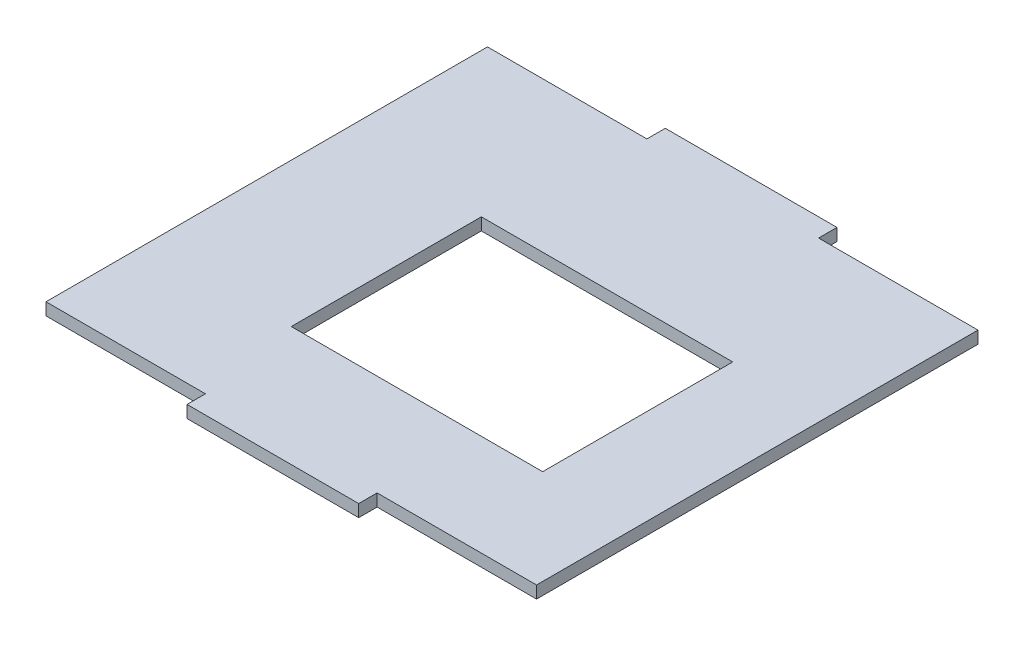
ISO-10303-21;
HEADER;
FILE_DESCRIPTION(('STEP AP214'),'2;1');
FILE_NAME('part.step','',(''),(''),'','','');
FILE_SCHEMA(('AUTOMOTIVE_DESIGN { 1 0 10303 214 1 1 1 1 }'));
ENDSEC;
DATA;
#1=APPLICATION_CONTEXT('core data for automotive mechanical design processes');
#2=APPLICATION_PROTOCOL_DEFINITION('international standard','automotive_design',2000,#1);
#3=PRODUCT_CONTEXT('',#1,'mechanical');
#4=PRODUCT('Part','Part','',(#3));
#5=PRODUCT_RELATED_PRODUCT_CATEGORY('part','',(#4));
#6=PRODUCT_DEFINITION_FORMATION('','',#4);
#7=PRODUCT_DEFINITION_CONTEXT('part definition',#1,'design');
#8=PRODUCT_DEFINITION('design','',#6,#7);
#9=PRODUCT_DEFINITION_SHAPE('','',#8);
#10=(LENGTH_UNIT() NAMED_UNIT(*) SI_UNIT(.MILLI.,.METRE.));
#11=(NAMED_UNIT(*) PLANE_ANGLE_UNIT() SI_UNIT($,.RADIAN.));
#12=(NAMED_UNIT(*) SI_UNIT($,.STERADIAN.) SOLID_ANGLE_UNIT());
#13=UNCERTAINTY_MEASURE_WITH_UNIT(LENGTH_MEASURE(1.E-05),#10,'distance_accuracy_value','');
#14=(GEOMETRIC_REPRESENTATION_CONTEXT(3) GLOBAL_UNCERTAINTY_ASSIGNED_CONTEXT((#13)) GLOBAL_UNIT_ASSIGNED_CONTEXT((#10,
#11,#12)) REPRESENTATION_CONTEXT('',''));
#15=CARTESIAN_POINT('',(0.,0.,0.));
#16=DIRECTION('',(0.,0.,1.));
#17=DIRECTION('',(1.,0.,0.));
#18=AXIS2_PLACEMENT_3D('',#15,#16,#17);
#19=CARTESIAN_POINT('',(-21.5,1.,-19.5));
#20=DIRECTION('',(0.,0.,1.));
#21=DIRECTION('',(1.,0.,0.));
#22=AXIS2_PLACEMENT_3D('',#19,#20,#21);
#23=PLANE('',#22);
#24=DIRECTION('',(-1.,0.,0.));
#25=VECTOR('',#24,1.);
#26=CARTESIAN_POINT('',(-21.5,0.,-19.5));
#27=LINE('',#26,#25);
#28=CARTESIAN_POINT('',(7.,0.,-19.5));
#29=VERTEX_POINT('',#28);
#30=CARTESIAN_POINT('',(-7.,0.,-19.5));
#31=VERTEX_POINT('',#30);
#32=EDGE_CURVE('E237',#29,#31,#27,.T.);
#33=ORIENTED_EDGE('',*,*,#32,.T.);
#34=DIRECTION('',(0.,-1.,0.));
#35=VECTOR('',#34,1.);
#36=CARTESIAN_POINT('',(-7.,1.001,-19.5));
#37=LINE('',#36,#35);
#38=CARTESIAN_POINT('',(-7.,1.,-19.5));
#39=VERTEX_POINT('',#38);
#40=EDGE_CURVE('E56',#39,#31,#37,.T.);
#41=ORIENTED_EDGE('',*,*,#40,.F.);
#42=DIRECTION('',(-1.,0.,0.));
#43=VECTOR('',#42,1.);
#44=CARTESIAN_POINT('',(-21.5,1.,-19.5));
#45=LINE('',#44,#43);
#46=CARTESIAN_POINT('',(7.,1.,-19.5));
#47=VERTEX_POINT('',#46);
#48=EDGE_CURVE('E48',#47,#39,#45,.T.);
#49=ORIENTED_EDGE('',*,*,#48,.F.);
#50=DIRECTION('',(0.,-1.,0.));
#51=VECTOR('',#50,1.);
#52=CARTESIAN_POINT('',(7.,1.001,-19.5));
#53=LINE('',#52,#51);
#54=EDGE_CURVE('E183',#47,#29,#53,.T.);
#55=ORIENTED_EDGE('',*,*,#54,.T.);
#56=EDGE_LOOP('',(#33,#41,#49,#55));
#57=FACE_BOUND('',#56,.T.);
#58=ADVANCED_FACE('F39',(#57),#23,.F.);
#59=CARTESIAN_POINT('',(-21.5,1.,19.5));
#60=DIRECTION('',(0.,0.,-1.));
#61=DIRECTION('',(-1.,0.,0.));
#62=AXIS2_PLACEMENT_3D('',#59,#60,#61);
#63=PLANE('',#62);
#64=DIRECTION('',(1.,0.,0.));
#65=VECTOR('',#64,1.);
#66=CARTESIAN_POINT('',(-21.5,1.,19.5));
#67=LINE('',#66,#65);
#68=CARTESIAN_POINT('',(-7.,1.,19.5));
#69=VERTEX_POINT('',#68);
#70=CARTESIAN_POINT('',(7.,1.,19.5));
#71=VERTEX_POINT('',#70);
#72=EDGE_CURVE('E11',#69,#71,#67,.T.);
#73=ORIENTED_EDGE('',*,*,#72,.F.);
#74=DIRECTION('',(0.,-1.,0.));
#75=VECTOR('',#74,1.);
#76=CARTESIAN_POINT('',(-7.,1.001,19.5));
#77=LINE('',#76,#75);
#78=CARTESIAN_POINT('',(-7.,0.,19.5));
#79=VERTEX_POINT('',#78);
#80=EDGE_CURVE('E155',#69,#79,#77,.T.);
#81=ORIENTED_EDGE('',*,*,#80,.T.);
#82=DIRECTION('',(1.,0.,0.));
#83=VECTOR('',#82,1.);
#84=CARTESIAN_POINT('',(-21.5,0.,19.5));
#85=LINE('',#84,#83);
#86=CARTESIAN_POINT('',(7.,0.,19.5));
#87=VERTEX_POINT('',#86);
#88=EDGE_CURVE('E42',#79,#87,#85,.T.);
#89=ORIENTED_EDGE('',*,*,#88,.T.);
#90=DIRECTION('',(0.,-1.,0.));
#91=VECTOR('',#90,1.);
#92=CARTESIAN_POINT('',(7.,1.001,19.5));
#93=LINE('',#92,#91);
#94=EDGE_CURVE('E64',#71,#87,#93,.T.);
#95=ORIENTED_EDGE('',*,*,#94,.F.);
#96=EDGE_LOOP('',(#73,#81,#89,#95));
#97=FACE_BOUND('',#96,.T.);
#98=ADVANCED_FACE('F180',(#97),#63,.F.);
#99=CARTESIAN_POINT('',(0.,1.,0.));
#100=DIRECTION('',(0.,1.,0.));
#101=DIRECTION('',(0.,0.,1.));
#102=AXIS2_PLACEMENT_3D('',#99,#100,#101);
#103=PLANE('',#102);
#104=DIRECTION('',(0.,0.,1.));
#105=VECTOR('',#104,1.);
#106=CARTESIAN_POINT('',(-7.,1.,0.));
#107=LINE('',#106,#105);
#108=CARTESIAN_POINT('',(-7.,1.,18.));
#109=VERTEX_POINT('',#108);
#110=EDGE_CURVE('E158',#109,#69,#107,.T.);
#111=ORIENTED_EDGE('',*,*,#110,.T.);
#112=ORIENTED_EDGE('',*,*,#72,.T.);
#113=DIRECTION('',(0.,0.,1.));
#114=VECTOR('',#113,1.);
#115=CARTESIAN_POINT('',(7.,1.,0.));
#116=LINE('',#115,#114);
#117=CARTESIAN_POINT('',(7.,1.,18.));
#118=VERTEX_POINT('',#117);
#119=EDGE_CURVE('E286',#118,#71,#116,.T.);
#120=ORIENTED_EDGE('',*,*,#119,.F.);
#121=DIRECTION('',(-1.,0.,0.));
#122=VECTOR('',#121,1.);
#123=CARTESIAN_POINT('',(0.,1.,18.));
#124=LINE('',#123,#122);
#125=CARTESIAN_POINT('',(20.,1.,18.));
#126=VERTEX_POINT('',#125);
#127=EDGE_CURVE('E289',#126,#118,#124,.T.);
#128=ORIENTED_EDGE('',*,*,#127,.F.);
#129=DIRECTION('',(0.,0.,1.));
#130=VECTOR('',#129,1.);
#131=CARTESIAN_POINT('',(20.,1.,0.));
#132=LINE('',#131,#130);
#133=CARTESIAN_POINT('',(20.,1.,-18.));
#134=VERTEX_POINT('',#133);
#135=EDGE_CURVE('E292',#134,#126,#132,.T.);
#136=ORIENTED_EDGE('',*,*,#135,.F.);
#137=DIRECTION('',(1.,0.,0.));
#138=VECTOR('',#137,1.);
#139=CARTESIAN_POINT('',(0.,1.,-18.));
#140=LINE('',#139,#138);
#141=CARTESIAN_POINT('',(7.,1.,-18.));
#142=VERTEX_POINT('',#141);
#143=EDGE_CURVE('E295',#142,#134,#140,.T.);
#144=ORIENTED_EDGE('',*,*,#143,.F.);
#145=DIRECTION('',(0.,0.,1.));
#146=VECTOR('',#145,1.);
#147=CARTESIAN_POINT('',(7.,1.,0.));
#148=LINE('',#147,#146);
#149=EDGE_CURVE('E298',#47,#142,#148,.T.);
#150=ORIENTED_EDGE('',*,*,#149,.F.);
#151=ORIENTED_EDGE('',*,*,#48,.T.);
#152=DIRECTION('',(0.,0.,1.));
#153=VECTOR('',#152,1.);
#154=CARTESIAN_POINT('',(-7.,1.,0.));
#155=LINE('',#154,#153);
#156=CARTESIAN_POINT('',(-7.,1.,-18.));
#157=VERTEX_POINT('',#156);
#158=EDGE_CURVE('E167',#39,#157,#155,.T.);
#159=ORIENTED_EDGE('',*,*,#158,.T.);
#160=DIRECTION('',(1.,0.,0.));
#161=VECTOR('',#160,1.);
#162=CARTESIAN_POINT('',(0.,1.,-18.));
#163=LINE('',#162,#161);
#164=CARTESIAN_POINT('',(-20.,1.,-18.));
#165=VERTEX_POINT('',#164);
#166=EDGE_CURVE('E317',#165,#157,#163,.T.);
#167=ORIENTED_EDGE('',*,*,#166,.F.);
#168=DIRECTION('',(0.,0.,-1.));
#169=VECTOR('',#168,1.);
#170=CARTESIAN_POINT('',(-20.,1.,0.));
#171=LINE('',#170,#169);
#172=CARTESIAN_POINT('',(-20.,1.,18.));
#173=VERTEX_POINT('',#172);
#174=EDGE_CURVE('E475',#173,#165,#171,.T.);
#175=ORIENTED_EDGE('',*,*,#174,.F.);
#176=DIRECTION('',(-1.,0.,0.));
#177=VECTOR('',#176,1.);
#178=CARTESIAN_POINT('',(0.,1.,18.));
#179=LINE('',#178,#177);
#180=EDGE_CURVE('E176',#109,#173,#179,.T.);
#181=ORIENTED_EDGE('',*,*,#180,.F.);
#182=EDGE_LOOP('',(#111,#112,#120,#128,#136,#144,#150,#151,#159,#167,#175,#181));
#183=FACE_BOUND('',#182,.T.);
#184=DIRECTION('',(0.,0.,-1.));
#185=VECTOR('',#184,1.);
#186=CARTESIAN_POINT('',(12.25,1.,-5.75));
#187=LINE('',#186,#185);
#188=CARTESIAN_POINT('',(12.25,1.,9.75));
#189=VERTEX_POINT('',#188);
#190=CARTESIAN_POINT('',(12.25,1.,-5.75));
#191=VERTEX_POINT('',#190);
#192=EDGE_CURVE('E205',#189,#191,#187,.T.);
#193=ORIENTED_EDGE('',*,*,#192,.F.);
#194=DIRECTION('',(1.,0.,0.));
#195=VECTOR('',#194,1.);
#196=CARTESIAN_POINT('',(-8.25,1.,9.75));
#197=LINE('',#196,#195);
#198=CARTESIAN_POINT('',(-8.25,1.,9.75));
#199=VERTEX_POINT('',#198);
#200=EDGE_CURVE('E216',#199,#189,#197,.T.);
#201=ORIENTED_EDGE('',*,*,#200,.F.);
#202=DIRECTION('',(0.,0.,1.));
#203=VECTOR('',#202,1.);
#204=CARTESIAN_POINT('',(-8.25,1.,-5.75));
#205=LINE('',#204,#203);
#206=CARTESIAN_POINT('',(-8.25,1.,-5.75));
#207=VERTEX_POINT('',#206);
#208=EDGE_CURVE('E212',#207,#199,#205,.T.);
#209=ORIENTED_EDGE('',*,*,#208,.F.);
#210=DIRECTION('',(-1.,0.,0.));
#211=VECTOR('',#210,1.);
#212=CARTESIAN_POINT('',(-8.25,1.,-5.75));
#213=LINE('',#212,#211);
#214=EDGE_CURVE('E208',#191,#207,#213,.T.);
#215=ORIENTED_EDGE('',*,*,#214,.F.);
#216=EDGE_LOOP('',(#193,#201,#209,#215));
#217=FACE_BOUND('',#216,.T.);
#218=ADVANCED_FACE('F172',(#183,#217),#103,.T.);
#219=CARTESIAN_POINT('',(0.,0.,0.));
#220=DIRECTION('',(0.,1.,0.));
#221=DIRECTION('',(0.,0.,1.));
#222=AXIS2_PLACEMENT_3D('',#219,#220,#221);
#223=PLANE('',#222);
#224=DIRECTION('',(-1.,0.,0.));
#225=VECTOR('',#224,1.);
#226=CARTESIAN_POINT('',(-8.25,0.,9.75));
#227=LINE('',#226,#225);
#228=CARTESIAN_POINT('',(12.25,0.,9.75));
#229=VERTEX_POINT('',#228);
#230=CARTESIAN_POINT('',(-8.25,0.,9.75));
#231=VERTEX_POINT('',#230);
#232=EDGE_CURVE('E197',#229,#231,#227,.T.);
#233=ORIENTED_EDGE('',*,*,#232,.F.);
#234=DIRECTION('',(0.,0.,1.));
#235=VECTOR('',#234,1.);
#236=CARTESIAN_POINT('',(12.25,0.,-5.75));
#237=LINE('',#236,#235);
#238=CARTESIAN_POINT('',(12.25,0.,-5.75));
#239=VERTEX_POINT('',#238);
#240=EDGE_CURVE('E201',#239,#229,#237,.T.);
#241=ORIENTED_EDGE('',*,*,#240,.F.);
#242=DIRECTION('',(1.,0.,0.));
#243=VECTOR('',#242,1.);
#244=CARTESIAN_POINT('',(-8.25,0.,-5.75));
#245=LINE('',#244,#243);
#246=CARTESIAN_POINT('',(-8.25,0.,-5.75));
#247=VERTEX_POINT('',#246);
#248=EDGE_CURVE('E224',#247,#239,#245,.T.);
#249=ORIENTED_EDGE('',*,*,#248,.F.);
#250=DIRECTION('',(0.,0.,-1.));
#251=VECTOR('',#250,1.);
#252=CARTESIAN_POINT('',(-8.25,0.,-5.75));
#253=LINE('',#252,#251);
#254=EDGE_CURVE('E194',#231,#247,#253,.T.);
#255=ORIENTED_EDGE('',*,*,#254,.F.);
#256=EDGE_LOOP('',(#233,#241,#249,#255));
#257=FACE_BOUND('',#256,.T.);
#258=ORIENTED_EDGE('',*,*,#88,.F.);
#259=DIRECTION('',(0.,0.,1.));
#260=VECTOR('',#259,1.);
#261=CARTESIAN_POINT('',(-7.,0.,0.));
#262=LINE('',#261,#260);
#263=CARTESIAN_POINT('',(-7.,0.,18.));
#264=VERTEX_POINT('',#263);
#265=EDGE_CURVE('E161',#264,#79,#262,.T.);
#266=ORIENTED_EDGE('',*,*,#265,.F.);
#267=DIRECTION('',(-1.,0.,0.));
#268=VECTOR('',#267,1.);
#269=CARTESIAN_POINT('',(0.,0.,18.));
#270=LINE('',#269,#268);
#271=CARTESIAN_POINT('',(-20.,0.,18.));
#272=VERTEX_POINT('',#271);
#273=EDGE_CURVE('E262',#264,#272,#270,.T.);
#274=ORIENTED_EDGE('',*,*,#273,.T.);
#275=DIRECTION('',(0.,0.,-1.));
#276=VECTOR('',#275,1.);
#277=CARTESIAN_POINT('',(-20.,0.,0.));
#278=LINE('',#277,#276);
#279=CARTESIAN_POINT('',(-20.,0.,-18.));
#280=VERTEX_POINT('',#279);
#281=EDGE_CURVE('E259',#272,#280,#278,.T.);
#282=ORIENTED_EDGE('',*,*,#281,.T.);
#283=DIRECTION('',(1.,0.,0.));
#284=VECTOR('',#283,1.);
#285=CARTESIAN_POINT('',(0.,0.,-18.));
#286=LINE('',#285,#284);
#287=CARTESIAN_POINT('',(-7.,0.,-18.));
#288=VERTEX_POINT('',#287);
#289=EDGE_CURVE('E254',#280,#288,#286,.T.);
#290=ORIENTED_EDGE('',*,*,#289,.T.);
#291=EDGE_CURVE('E178',#31,#288,#262,.T.);
#292=ORIENTED_EDGE('',*,*,#291,.F.);
#293=ORIENTED_EDGE('',*,*,#32,.F.);
#294=DIRECTION('',(0.,0.,1.));
#295=VECTOR('',#294,1.);
#296=CARTESIAN_POINT('',(7.,0.,0.));
#297=LINE('',#296,#295);
#298=CARTESIAN_POINT('',(7.,0.,-18.));
#299=VERTEX_POINT('',#298);
#300=EDGE_CURVE('E250',#29,#299,#297,.T.);
#301=ORIENTED_EDGE('',*,*,#300,.T.);
#302=DIRECTION('',(1.,0.,0.));
#303=VECTOR('',#302,1.);
#304=CARTESIAN_POINT('',(0.,0.,-18.));
#305=LINE('',#304,#303);
#306=CARTESIAN_POINT('',(20.,0.,-18.));
#307=VERTEX_POINT('',#306);
#308=EDGE_CURVE('E190',#299,#307,#305,.T.);
#309=ORIENTED_EDGE('',*,*,#308,.T.);
#310=DIRECTION('',(0.,0.,1.));
#311=VECTOR('',#310,1.);
#312=CARTESIAN_POINT('',(20.,0.,0.));
#313=LINE('',#312,#311);
#314=CARTESIAN_POINT('',(20.,0.,18.));
#315=VERTEX_POINT('',#314);
#316=EDGE_CURVE('E308',#307,#315,#313,.T.);
#317=ORIENTED_EDGE('',*,*,#316,.T.);
#318=DIRECTION('',(-1.,0.,0.));
#319=VECTOR('',#318,1.);
#320=CARTESIAN_POINT('',(0.,0.,18.));
#321=LINE('',#320,#319);
#322=CARTESIAN_POINT('',(7.,0.,18.));
#323=VERTEX_POINT('',#322);
#324=EDGE_CURVE('E304',#315,#323,#321,.T.);
#325=ORIENTED_EDGE('',*,*,#324,.T.);
#326=EDGE_CURVE('E303',#323,#87,#297,.T.);
#327=ORIENTED_EDGE('',*,*,#326,.T.);
#328=EDGE_LOOP('',(#258,#266,#274,#282,#290,#292,#293,#301,#309,#317,#325,#327));
#329=FACE_BOUND('',#328,.T.);
#330=ADVANCED_FACE('F248',(#257,#329),#223,.F.);
#331=CARTESIAN_POINT('',(12.25,-0.000999999999999916,-5.75));
#332=DIRECTION('',(1.,0.,0.));
#333=DIRECTION('',(0.,0.,-1.));
#334=AXIS2_PLACEMENT_3D('',#331,#332,#333);
#335=PLANE('',#334);
#336=ORIENTED_EDGE('',*,*,#240,.T.);
#337=DIRECTION('',(0.,1.,0.));
#338=VECTOR('',#337,1.);
#339=CARTESIAN_POINT('',(12.25,-0.000999999999999916,9.75));
#340=LINE('',#339,#338);
#341=EDGE_CURVE('E221',#229,#189,#340,.T.);
#342=ORIENTED_EDGE('',*,*,#341,.T.);
#343=ORIENTED_EDGE('',*,*,#192,.T.);
#344=DIRECTION('',(0.,1.,0.));
#345=VECTOR('',#344,1.);
#346=CARTESIAN_POINT('',(12.25,-0.000999999999999916,-5.75));
#347=LINE('',#346,#345);
#348=EDGE_CURVE('E220',#239,#191,#347,.T.);
#349=ORIENTED_EDGE('',*,*,#348,.F.);
#350=EDGE_LOOP('',(#336,#342,#343,#349));
#351=FACE_BOUND('',#350,.T.);
#352=ADVANCED_FACE('F365',(#351),#335,.F.);
#353=CARTESIAN_POINT('',(-8.25,-0.000999999999999916,9.75));
#354=DIRECTION('',(0.,0.,1.));
#355=DIRECTION('',(1.,0.,0.));
#356=AXIS2_PLACEMENT_3D('',#353,#354,#355);
#357=PLANE('',#356);
#358=ORIENTED_EDGE('',*,*,#232,.T.);
#359=DIRECTION('',(0.,1.,0.));
#360=VECTOR('',#359,1.);
#361=CARTESIAN_POINT('',(-8.25,-0.000999999999999916,9.75));
#362=LINE('',#361,#360);
#363=EDGE_CURVE('E225',#231,#199,#362,.T.);
#364=ORIENTED_EDGE('',*,*,#363,.T.);
#365=ORIENTED_EDGE('',*,*,#200,.T.);
#366=ORIENTED_EDGE('',*,*,#341,.F.);
#367=EDGE_LOOP('',(#358,#364,#365,#366));
#368=FACE_BOUND('',#367,.T.);
#369=ADVANCED_FACE('F370',(#368),#357,.F.);
#370=CARTESIAN_POINT('',(-8.25,-0.000999999999999916,-5.75));
#371=DIRECTION('',(-1.,0.,0.));
#372=DIRECTION('',(0.,0.,1.));
#373=AXIS2_PLACEMENT_3D('',#370,#371,#372);
#374=PLANE('',#373);
#375=ORIENTED_EDGE('',*,*,#254,.T.);
#376=DIRECTION('',(0.,1.,0.));
#377=VECTOR('',#376,1.);
#378=CARTESIAN_POINT('',(-8.25,-0.000999999999999916,-5.75));
#379=LINE('',#378,#377);
#380=EDGE_CURVE('E228',#247,#207,#379,.T.);
#381=ORIENTED_EDGE('',*,*,#380,.T.);
#382=ORIENTED_EDGE('',*,*,#208,.T.);
#383=ORIENTED_EDGE('',*,*,#363,.F.);
#384=EDGE_LOOP('',(#375,#381,#382,#383));
#385=FACE_BOUND('',#384,.T.);
#386=ADVANCED_FACE('F374',(#385),#374,.F.);
#387=CARTESIAN_POINT('',(-8.25,-0.000999999999999916,-5.75));
#388=DIRECTION('',(0.,0.,-1.));
#389=DIRECTION('',(-1.,0.,0.));
#390=AXIS2_PLACEMENT_3D('',#387,#388,#389);
#391=PLANE('',#390);
#392=ORIENTED_EDGE('',*,*,#248,.T.);
#393=ORIENTED_EDGE('',*,*,#348,.T.);
#394=ORIENTED_EDGE('',*,*,#214,.T.);
#395=ORIENTED_EDGE('',*,*,#380,.F.);
#396=EDGE_LOOP('',(#392,#393,#394,#395));
#397=FACE_BOUND('',#396,.T.);
#398=ADVANCED_FACE('F353',(#397),#391,.F.);
#399=CARTESIAN_POINT('',(7.,1.001,0.));
#400=DIRECTION('',(1.,0.,0.));
#401=DIRECTION('',(0.,0.,-1.));
#402=AXIS2_PLACEMENT_3D('',#399,#400,#401);
#403=PLANE('',#402);
#404=ORIENTED_EDGE('',*,*,#149,.T.);
#405=DIRECTION('',(0.,-1.,0.));
#406=VECTOR('',#405,1.);
#407=CARTESIAN_POINT('',(7.,1.001,-18.));
#408=LINE('',#407,#406);
#409=EDGE_CURVE('E314',#142,#299,#408,.T.);
#410=ORIENTED_EDGE('',*,*,#409,.T.);
#411=ORIENTED_EDGE('',*,*,#300,.F.);
#412=ORIENTED_EDGE('',*,*,#54,.F.);
#413=EDGE_LOOP('',(#404,#410,#411,#412));
#414=FACE_BOUND('',#413,.T.);
#415=ADVANCED_FACE('F342',(#414),#403,.T.);
#416=CARTESIAN_POINT('',(0.,1.001,-18.));
#417=DIRECTION('',(0.,0.,-1.));
#418=DIRECTION('',(-1.,0.,0.));
#419=AXIS2_PLACEMENT_3D('',#416,#417,#418);
#420=PLANE('',#419);
#421=ORIENTED_EDGE('',*,*,#143,.T.);
#422=DIRECTION('',(0.,-1.,0.));
#423=VECTOR('',#422,1.);
#424=CARTESIAN_POINT('',(20.,1.001,-18.));
#425=LINE('',#424,#423);
#426=EDGE_CURVE('E318',#134,#307,#425,.T.);
#427=ORIENTED_EDGE('',*,*,#426,.T.);
#428=ORIENTED_EDGE('',*,*,#308,.F.);
#429=ORIENTED_EDGE('',*,*,#409,.F.);
#430=EDGE_LOOP('',(#421,#427,#428,#429));
#431=FACE_BOUND('',#430,.T.);
#432=ADVANCED_FACE('F335',(#431),#420,.T.);
#433=CARTESIAN_POINT('',(20.,1.001,0.));
#434=DIRECTION('',(1.,0.,0.));
#435=DIRECTION('',(0.,0.,-1.));
#436=AXIS2_PLACEMENT_3D('',#433,#434,#435);
#437=PLANE('',#436);
#438=ORIENTED_EDGE('',*,*,#135,.T.);
#439=DIRECTION('',(0.,-1.,0.));
#440=VECTOR('',#439,1.);
#441=CARTESIAN_POINT('',(20.,1.001,18.));
#442=LINE('',#441,#440);
#443=EDGE_CURVE('E187',#126,#315,#442,.T.);
#444=ORIENTED_EDGE('',*,*,#443,.T.);
#445=ORIENTED_EDGE('',*,*,#316,.F.);
#446=ORIENTED_EDGE('',*,*,#426,.F.);
#447=EDGE_LOOP('',(#438,#444,#445,#446));
#448=FACE_BOUND('',#447,.T.);
#449=ADVANCED_FACE('F325',(#448),#437,.T.);
#450=CARTESIAN_POINT('',(0.,1.001,18.));
#451=DIRECTION('',(0.,0.,1.));
#452=DIRECTION('',(1.,0.,0.));
#453=AXIS2_PLACEMENT_3D('',#450,#451,#452);
#454=PLANE('',#453);
#455=ORIENTED_EDGE('',*,*,#127,.T.);
#456=DIRECTION('',(0.,-1.,0.));
#457=VECTOR('',#456,1.);
#458=CARTESIAN_POINT('',(7.,1.001,18.));
#459=LINE('',#458,#457);
#460=EDGE_CURVE('E182',#118,#323,#459,.T.);
#461=ORIENTED_EDGE('',*,*,#460,.T.);
#462=ORIENTED_EDGE('',*,*,#324,.F.);
#463=ORIENTED_EDGE('',*,*,#443,.F.);
#464=EDGE_LOOP('',(#455,#461,#462,#463));
#465=FACE_BOUND('',#464,.T.);
#466=ADVANCED_FACE('F330',(#465),#454,.T.);
#467=ORIENTED_EDGE('',*,*,#119,.T.);
#468=ORIENTED_EDGE('',*,*,#94,.T.);
#469=ORIENTED_EDGE('',*,*,#326,.F.);
#470=ORIENTED_EDGE('',*,*,#460,.F.);
#471=EDGE_LOOP('',(#467,#468,#469,#470));
#472=FACE_BOUND('',#471,.T.);
#473=ADVANCED_FACE('F338',(#472),#403,.T.);
#474=CARTESIAN_POINT('',(-7.,1.001,0.));
#475=DIRECTION('',(1.,0.,0.));
#476=DIRECTION('',(0.,0.,-1.));
#477=AXIS2_PLACEMENT_3D('',#474,#475,#476);
#478=PLANE('',#477);
#479=DIRECTION('',(0.,-1.,0.));
#480=VECTOR('',#479,1.);
#481=CARTESIAN_POINT('',(-7.,1.001,18.));
#482=LINE('',#481,#480);
#483=EDGE_CURVE('E168',#109,#264,#482,.T.);
#484=ORIENTED_EDGE('',*,*,#483,.T.);
#485=ORIENTED_EDGE('',*,*,#265,.T.);
#486=ORIENTED_EDGE('',*,*,#80,.F.);
#487=ORIENTED_EDGE('',*,*,#110,.F.);
#488=EDGE_LOOP('',(#484,#485,#486,#487));
#489=FACE_BOUND('',#488,.T.);
#490=ADVANCED_FACE('F157',(#489),#478,.F.);
#491=CARTESIAN_POINT('',(0.,1.001,18.));
#492=DIRECTION('',(0.,0.,1.));
#493=DIRECTION('',(1.,0.,0.));
#494=AXIS2_PLACEMENT_3D('',#491,#492,#493);
#495=PLANE('',#494);
#496=ORIENTED_EDGE('',*,*,#180,.T.);
#497=DIRECTION('',(0.,-1.,0.));
#498=VECTOR('',#497,1.);
#499=CARTESIAN_POINT('',(-20.,1.001,18.));
#500=LINE('',#499,#498);
#501=EDGE_CURVE('E275',#173,#272,#500,.T.);
#502=ORIENTED_EDGE('',*,*,#501,.T.);
#503=ORIENTED_EDGE('',*,*,#273,.F.);
#504=ORIENTED_EDGE('',*,*,#483,.F.);
#505=EDGE_LOOP('',(#496,#502,#503,#504));
#506=FACE_BOUND('',#505,.T.);
#507=ADVANCED_FACE('F347',(#506),#495,.T.);
#508=CARTESIAN_POINT('',(-20.,1.001,0.));
#509=DIRECTION('',(-1.,0.,0.));
#510=DIRECTION('',(0.,0.,1.));
#511=AXIS2_PLACEMENT_3D('',#508,#509,#510);
#512=PLANE('',#511);
#513=ORIENTED_EDGE('',*,*,#174,.T.);
#514=DIRECTION('',(0.,-1.,0.));
#515=VECTOR('',#514,1.);
#516=CARTESIAN_POINT('',(-20.,1.001,-18.));
#517=LINE('',#516,#515);
#518=EDGE_CURVE('E278',#165,#280,#517,.T.);
#519=ORIENTED_EDGE('',*,*,#518,.T.);
#520=ORIENTED_EDGE('',*,*,#281,.F.);
#521=ORIENTED_EDGE('',*,*,#501,.F.);
#522=EDGE_LOOP('',(#513,#519,#520,#521));
#523=FACE_BOUND('',#522,.T.);
#524=ADVANCED_FACE('F441',(#523),#512,.T.);
#525=CARTESIAN_POINT('',(0.,1.001,-18.));
#526=DIRECTION('',(0.,0.,-1.));
#527=DIRECTION('',(-1.,0.,0.));
#528=AXIS2_PLACEMENT_3D('',#525,#526,#527);
#529=PLANE('',#528);
#530=ORIENTED_EDGE('',*,*,#166,.T.);
#531=DIRECTION('',(0.,-1.,0.));
#532=VECTOR('',#531,1.);
#533=CARTESIAN_POINT('',(-7.,1.001,-18.));
#534=LINE('',#533,#532);
#535=EDGE_CURVE('E265',#157,#288,#534,.T.);
#536=ORIENTED_EDGE('',*,*,#535,.T.);
#537=ORIENTED_EDGE('',*,*,#289,.F.);
#538=ORIENTED_EDGE('',*,*,#518,.F.);
#539=EDGE_LOOP('',(#530,#536,#537,#538));
#540=FACE_BOUND('',#539,.T.);
#541=ADVANCED_FACE('F451',(#540),#529,.T.);
#542=ORIENTED_EDGE('',*,*,#40,.T.);
#543=ORIENTED_EDGE('',*,*,#291,.T.);
#544=ORIENTED_EDGE('',*,*,#535,.F.);
#545=ORIENTED_EDGE('',*,*,#158,.F.);
#546=EDGE_LOOP('',(#542,#543,#544,#545));
#547=FACE_BOUND('',#546,.T.);
#548=ADVANCED_FACE('F349',(#547),#478,.F.);
#549=CLOSED_SHELL('',(#58,#98,#218,#330,#352,#369,#386,#398,#415,#432,#449,#466,#473,#490,#507,
#524,#541,#548));
#550=MANIFOLD_SOLID_BREP('B2',#549);
#551=ADVANCED_BREP_SHAPE_REPRESENTATION('',(#18,#550),#14);
#552=SHAPE_DEFINITION_REPRESENTATION(#9,#551);
ENDSEC;
END-ISO-10303-21;
